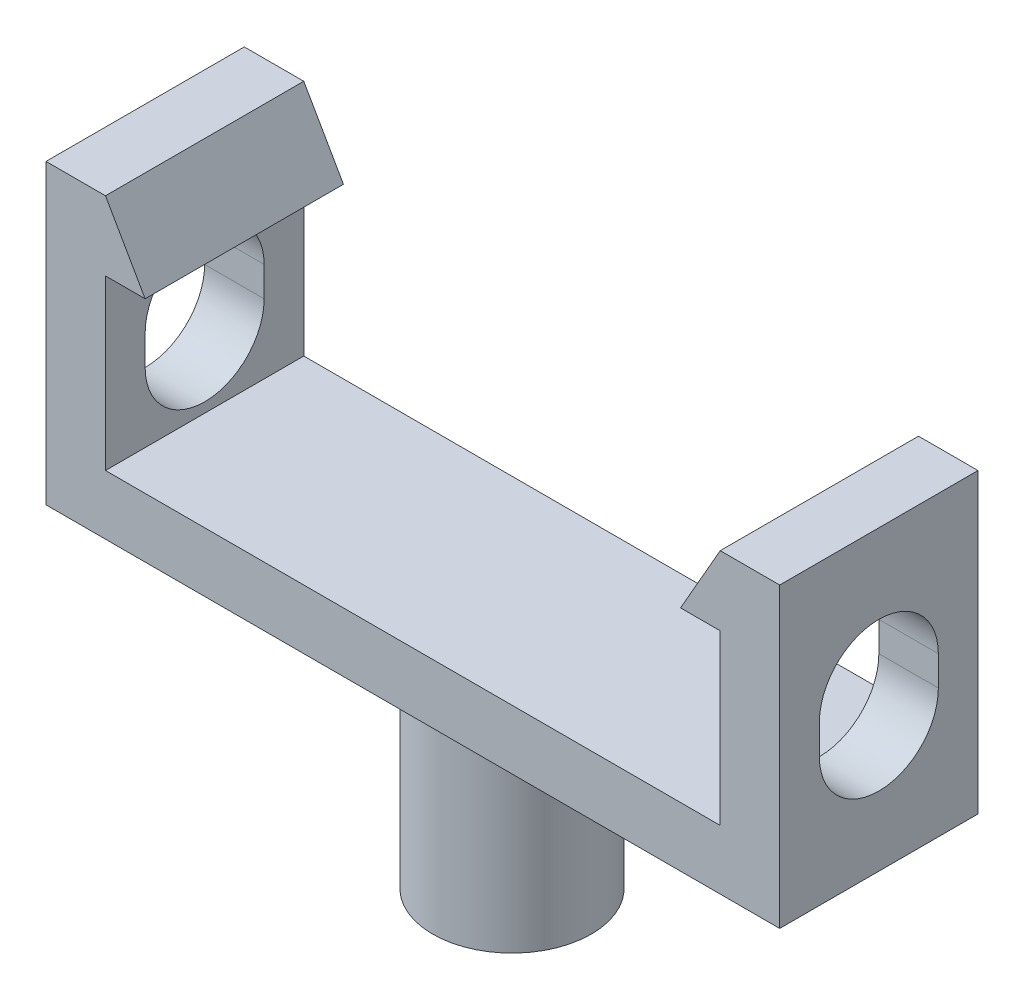
ISO-10303-21;
HEADER;
FILE_DESCRIPTION(('STEP AP214'),'2;1');
FILE_NAME('part.step','',(''),(''),'','','');
FILE_SCHEMA(('AUTOMOTIVE_DESIGN { 1 0 10303 214 1 1 1 1 }'));
ENDSEC;
DATA;
#1=APPLICATION_CONTEXT('core data for automotive mechanical design processes');
#2=APPLICATION_PROTOCOL_DEFINITION('international standard','automotive_design',2000,#1);
#3=PRODUCT_CONTEXT('',#1,'mechanical');
#4=PRODUCT('Part','Part','',(#3));
#5=PRODUCT_RELATED_PRODUCT_CATEGORY('part','',(#4));
#6=PRODUCT_DEFINITION_FORMATION('','',#4);
#7=PRODUCT_DEFINITION_CONTEXT('part definition',#1,'design');
#8=PRODUCT_DEFINITION('design','',#6,#7);
#9=PRODUCT_DEFINITION_SHAPE('','',#8);
#10=(LENGTH_UNIT() NAMED_UNIT(*) SI_UNIT(.MILLI.,.METRE.));
#11=(NAMED_UNIT(*) PLANE_ANGLE_UNIT() SI_UNIT($,.RADIAN.));
#12=(NAMED_UNIT(*) SI_UNIT($,.STERADIAN.) SOLID_ANGLE_UNIT());
#13=UNCERTAINTY_MEASURE_WITH_UNIT(LENGTH_MEASURE(1.E-05),#10,'distance_accuracy_value','');
#14=(GEOMETRIC_REPRESENTATION_CONTEXT(3) GLOBAL_UNCERTAINTY_ASSIGNED_CONTEXT((#13)) GLOBAL_UNIT_ASSIGNED_CONTEXT((#10,
#11,#12)) REPRESENTATION_CONTEXT('',''));
#15=CARTESIAN_POINT('',(0.,0.,0.));
#16=DIRECTION('',(0.,0.,1.));
#17=DIRECTION('',(1.,0.,0.));
#18=AXIS2_PLACEMENT_3D('',#15,#16,#17);
#19=CARTESIAN_POINT('',(0.,12.,10.));
#20=DIRECTION('',(0.86824314212446,0.496138938356833,0.));
#21=DIRECTION('',(-0.496138938356833,0.86824314212446,0.));
#22=AXIS2_PLACEMENT_3D('',#19,#20,#21);
#23=PLANE('',#22);
#24=DIRECTION('',(0.496138938356833,-0.86824314212446,0.));
#25=VECTOR('',#24,1.);
#26=CARTESIAN_POINT('',(0.,12.,0.));
#27=LINE('',#26,#25);
#28=CARTESIAN_POINT('',(0.,12.,0.));
#29=VERTEX_POINT('',#28);
#30=CARTESIAN_POINT('',(2.,8.5,0.));
#31=VERTEX_POINT('',#30);
#32=EDGE_CURVE('E229',#29,#31,#27,.T.);
#33=ORIENTED_EDGE('',*,*,#32,.F.);
#34=DIRECTION('',(0.,0.,-1.));
#35=VECTOR('',#34,1.);
#36=CARTESIAN_POINT('',(0.,12.,10.));
#37=LINE('',#36,#35);
#38=CARTESIAN_POINT('',(0.,12.,10.));
#39=VERTEX_POINT('',#38);
#40=EDGE_CURVE('E288',#39,#29,#37,.T.);
#41=ORIENTED_EDGE('',*,*,#40,.F.);
#42=DIRECTION('',(0.496138938356833,-0.86824314212446,0.));
#43=VECTOR('',#42,1.);
#44=CARTESIAN_POINT('',(0.,12.,10.));
#45=LINE('',#44,#43);
#46=CARTESIAN_POINT('',(2.,8.5,10.));
#47=VERTEX_POINT('',#46);
#48=EDGE_CURVE('E230',#39,#47,#45,.T.);
#49=ORIENTED_EDGE('',*,*,#48,.T.);
#50=DIRECTION('',(0.,0.,-1.));
#51=VECTOR('',#50,1.);
#52=CARTESIAN_POINT('',(2.,8.5,10.));
#53=LINE('',#52,#51);
#54=EDGE_CURVE('E259',#47,#31,#53,.T.);
#55=ORIENTED_EDGE('',*,*,#54,.T.);
#56=EDGE_LOOP('',(#33,#41,#49,#55));
#57=FACE_BOUND('',#56,.T.);
#58=ADVANCED_FACE('F33',(#57),#23,.T.);
#59=CARTESIAN_POINT('',(0.,12.,10.));
#60=DIRECTION('',(0.,-1.,0.));
#61=DIRECTION('',(0.,0.,-1.));
#62=AXIS2_PLACEMENT_3D('',#59,#60,#61);
#63=PLANE('',#62);
#64=DIRECTION('',(-1.,0.,0.));
#65=VECTOR('',#64,1.);
#66=CARTESIAN_POINT('',(0.,12.,0.));
#67=LINE('',#66,#65);
#68=CARTESIAN_POINT('',(-3.,12.,0.));
#69=VERTEX_POINT('',#68);
#70=EDGE_CURVE('E234',#29,#69,#67,.T.);
#71=ORIENTED_EDGE('',*,*,#70,.T.);
#72=DIRECTION('',(0.,0.,-1.));
#73=VECTOR('',#72,1.);
#74=CARTESIAN_POINT('',(-3.,12.,10.));
#75=LINE('',#74,#73);
#76=CARTESIAN_POINT('',(-3.,12.,10.));
#77=VERTEX_POINT('',#76);
#78=EDGE_CURVE('E291',#77,#69,#75,.T.);
#79=ORIENTED_EDGE('',*,*,#78,.F.);
#80=DIRECTION('',(-1.,0.,0.));
#81=VECTOR('',#80,1.);
#82=CARTESIAN_POINT('',(0.,12.,10.));
#83=LINE('',#82,#81);
#84=EDGE_CURVE('E257',#39,#77,#83,.T.);
#85=ORIENTED_EDGE('',*,*,#84,.F.);
#86=ORIENTED_EDGE('',*,*,#40,.T.);
#87=EDGE_LOOP('',(#71,#79,#85,#86));
#88=FACE_BOUND('',#87,.T.);
#89=ADVANCED_FACE('F357',(#88),#63,.F.);
#90=CARTESIAN_POINT('',(-3.,12.,10.));
#91=DIRECTION('',(1.,0.,0.));
#92=DIRECTION('',(0.,1.,0.));
#93=AXIS2_PLACEMENT_3D('',#90,#91,#92);
#94=PLANE('',#93);
#95=DIRECTION('',(0.,-1.,0.));
#96=VECTOR('',#95,1.);
#97=CARTESIAN_POINT('',(-3.,5.,2.));
#98=LINE('',#97,#96);
#99=CARTESIAN_POINT('',(-3.,5.,2.));
#100=VERTEX_POINT('',#99);
#101=CARTESIAN_POINT('',(-3.,3.5,2.));
#102=VERTEX_POINT('',#101);
#103=EDGE_CURVE('E206',#100,#102,#98,.T.);
#104=ORIENTED_EDGE('',*,*,#103,.F.);
#105=CARTESIAN_POINT('',(-3.,5.,5.));
#106=DIRECTION('',(-1.,0.,0.));
#107=DIRECTION('',(0.,-1.,0.));
#108=AXIS2_PLACEMENT_3D('',#105,#106,#107);
#109=CIRCLE('',#108,3.);
#110=CARTESIAN_POINT('',(-3.,5.,8.));
#111=VERTEX_POINT('',#110);
#112=EDGE_CURVE('E48',#111,#100,#109,.T.);
#113=ORIENTED_EDGE('',*,*,#112,.F.);
#114=DIRECTION('',(0.,1.,0.));
#115=VECTOR('',#114,1.);
#116=CARTESIAN_POINT('',(-3.,5.,8.));
#117=LINE('',#116,#115);
#118=CARTESIAN_POINT('',(-3.,3.5,8.));
#119=VERTEX_POINT('',#118);
#120=EDGE_CURVE('E196',#119,#111,#117,.T.);
#121=ORIENTED_EDGE('',*,*,#120,.F.);
#122=CARTESIAN_POINT('',(-3.,3.5,5.));
#123=DIRECTION('',(-1.,0.,0.));
#124=DIRECTION('',(0.,-1.,0.));
#125=AXIS2_PLACEMENT_3D('',#122,#123,#124);
#126=CIRCLE('',#125,3.);
#127=EDGE_CURVE('E199',#102,#119,#126,.T.);
#128=ORIENTED_EDGE('',*,*,#127,.F.);
#129=EDGE_LOOP('',(#104,#113,#121,#128));
#130=FACE_BOUND('',#129,.T.);
#131=DIRECTION('',(0.,-1.,0.));
#132=VECTOR('',#131,1.);
#133=CARTESIAN_POINT('',(-3.,12.,0.));
#134=LINE('',#133,#132);
#135=CARTESIAN_POINT('',(-3.,-3.,0.));
#136=VERTEX_POINT('',#135);
#137=EDGE_CURVE('E285',#69,#136,#134,.T.);
#138=ORIENTED_EDGE('',*,*,#137,.T.);
#139=DIRECTION('',(0.,0.,-1.));
#140=VECTOR('',#139,1.);
#141=CARTESIAN_POINT('',(-3.,-3.,10.));
#142=LINE('',#141,#140);
#143=CARTESIAN_POINT('',(-3.,-3.,10.));
#144=VERTEX_POINT('',#143);
#145=EDGE_CURVE('E294',#144,#136,#142,.T.);
#146=ORIENTED_EDGE('',*,*,#145,.F.);
#147=DIRECTION('',(0.,-1.,0.));
#148=VECTOR('',#147,1.);
#149=CARTESIAN_POINT('',(-3.,12.,10.));
#150=LINE('',#149,#148);
#151=EDGE_CURVE('E255',#77,#144,#150,.T.);
#152=ORIENTED_EDGE('',*,*,#151,.F.);
#153=ORIENTED_EDGE('',*,*,#78,.T.);
#154=EDGE_LOOP('',(#138,#146,#152,#153));
#155=FACE_BOUND('',#154,.T.);
#156=ADVANCED_FACE('F337',(#130,#155),#94,.F.);
#157=CARTESIAN_POINT('',(-3.,-3.,10.));
#158=DIRECTION('',(0.,1.,0.));
#159=DIRECTION('',(-1.,0.,0.));
#160=AXIS2_PLACEMENT_3D('',#157,#158,#159);
#161=PLANE('',#160);
#162=CARTESIAN_POINT('',(15.5,-3.,5.));
#163=DIRECTION('',(0.,-1.,0.));
#164=DIRECTION('',(1.,0.,0.));
#165=AXIS2_PLACEMENT_3D('',#162,#163,#164);
#166=CIRCLE('',#165,3.99999999999999);
#167=CARTESIAN_POINT('',(19.5,-3.,5.));
#168=VERTEX_POINT('',#167);
#169=EDGE_CURVE('E11',#168,#168,#166,.T.);
#170=ORIENTED_EDGE('',*,*,#169,.F.);
#171=EDGE_LOOP('',(#170));
#172=FACE_BOUND('',#171,.T.);
#173=DIRECTION('',(1.,0.,0.));
#174=VECTOR('',#173,1.);
#175=CARTESIAN_POINT('',(-3.,-3.,0.));
#176=LINE('',#175,#174);
#177=CARTESIAN_POINT('',(34.,-3.,0.));
#178=VERTEX_POINT('',#177);
#179=EDGE_CURVE('E283',#136,#178,#176,.T.);
#180=ORIENTED_EDGE('',*,*,#179,.T.);
#181=DIRECTION('',(0.,0.,-1.));
#182=VECTOR('',#181,1.);
#183=CARTESIAN_POINT('',(34.,-3.,10.));
#184=LINE('',#183,#182);
#185=CARTESIAN_POINT('',(34.,-3.,10.));
#186=VERTEX_POINT('',#185);
#187=EDGE_CURVE('E297',#186,#178,#184,.T.);
#188=ORIENTED_EDGE('',*,*,#187,.F.);
#189=DIRECTION('',(1.,0.,0.));
#190=VECTOR('',#189,1.);
#191=CARTESIAN_POINT('',(-3.,-3.,10.));
#192=LINE('',#191,#190);
#193=EDGE_CURVE('E253',#144,#186,#192,.T.);
#194=ORIENTED_EDGE('',*,*,#193,.F.);
#195=ORIENTED_EDGE('',*,*,#145,.T.);
#196=EDGE_LOOP('',(#180,#188,#194,#195));
#197=FACE_BOUND('',#196,.T.);
#198=ADVANCED_FACE('F412',(#172,#197),#161,.F.);
#199=CARTESIAN_POINT('',(34.,-3.,10.));
#200=DIRECTION('',(-1.,0.,0.));
#201=DIRECTION('',(0.,0.,1.));
#202=AXIS2_PLACEMENT_3D('',#199,#200,#201);
#203=PLANE('',#202);
#204=DIRECTION('',(0.,1.,0.));
#205=VECTOR('',#204,1.);
#206=CARTESIAN_POINT('',(34.,5.,8.));
#207=LINE('',#206,#205);
#208=CARTESIAN_POINT('',(34.,3.5,8.));
#209=VERTEX_POINT('',#208);
#210=CARTESIAN_POINT('',(34.,5.,8.));
#211=VERTEX_POINT('',#210);
#212=EDGE_CURVE('E195',#209,#211,#207,.T.);
#213=ORIENTED_EDGE('',*,*,#212,.T.);
#214=CARTESIAN_POINT('',(34.,5.,5.));
#215=DIRECTION('',(-1.,0.,0.));
#216=DIRECTION('',(0.,-1.,0.));
#217=AXIS2_PLACEMENT_3D('',#214,#215,#216);
#218=CIRCLE('',#217,3.);
#219=CARTESIAN_POINT('',(34.,5.,2.));
#220=VERTEX_POINT('',#219);
#221=EDGE_CURVE('E177',#211,#220,#218,.T.);
#222=ORIENTED_EDGE('',*,*,#221,.T.);
#223=DIRECTION('',(0.,-1.,0.));
#224=VECTOR('',#223,1.);
#225=CARTESIAN_POINT('',(34.,5.,2.));
#226=LINE('',#225,#224);
#227=CARTESIAN_POINT('',(34.,3.5,2.));
#228=VERTEX_POINT('',#227);
#229=EDGE_CURVE('E187',#220,#228,#226,.T.);
#230=ORIENTED_EDGE('',*,*,#229,.T.);
#231=CARTESIAN_POINT('',(34.,3.5,5.));
#232=DIRECTION('',(-1.,0.,0.));
#233=DIRECTION('',(0.,-1.,0.));
#234=AXIS2_PLACEMENT_3D('',#231,#232,#233);
#235=CIRCLE('',#234,3.);
#236=EDGE_CURVE('E56',#228,#209,#235,.T.);
#237=ORIENTED_EDGE('',*,*,#236,.T.);
#238=EDGE_LOOP('',(#213,#222,#230,#237));
#239=FACE_BOUND('',#238,.T.);
#240=DIRECTION('',(0.,1.,0.));
#241=VECTOR('',#240,1.);
#242=CARTESIAN_POINT('',(34.,-3.,0.));
#243=LINE('',#242,#241);
#244=CARTESIAN_POINT('',(34.,12.,0.));
#245=VERTEX_POINT('',#244);
#246=EDGE_CURVE('E281',#178,#245,#243,.T.);
#247=ORIENTED_EDGE('',*,*,#246,.T.);
#248=DIRECTION('',(0.,0.,-1.));
#249=VECTOR('',#248,1.);
#250=CARTESIAN_POINT('',(34.,12.,10.));
#251=LINE('',#250,#249);
#252=CARTESIAN_POINT('',(34.,12.,10.));
#253=VERTEX_POINT('',#252);
#254=EDGE_CURVE('E300',#253,#245,#251,.T.);
#255=ORIENTED_EDGE('',*,*,#254,.F.);
#256=DIRECTION('',(0.,1.,0.));
#257=VECTOR('',#256,1.);
#258=CARTESIAN_POINT('',(34.,-3.,10.));
#259=LINE('',#258,#257);
#260=EDGE_CURVE('E251',#186,#253,#259,.T.);
#261=ORIENTED_EDGE('',*,*,#260,.F.);
#262=ORIENTED_EDGE('',*,*,#187,.T.);
#263=EDGE_LOOP('',(#247,#255,#261,#262));
#264=FACE_BOUND('',#263,.T.);
#265=ADVANCED_FACE('F192',(#239,#264),#203,.F.);
#266=CARTESIAN_POINT('',(34.,12.,10.));
#267=DIRECTION('',(0.,-1.,0.));
#268=DIRECTION('',(1.,0.,0.));
#269=AXIS2_PLACEMENT_3D('',#266,#267,#268);
#270=PLANE('',#269);
#271=DIRECTION('',(-1.,0.,0.));
#272=VECTOR('',#271,1.);
#273=CARTESIAN_POINT('',(34.,12.,0.));
#274=LINE('',#273,#272);
#275=CARTESIAN_POINT('',(31.,12.,0.));
#276=VERTEX_POINT('',#275);
#277=EDGE_CURVE('E278',#245,#276,#274,.T.);
#278=ORIENTED_EDGE('',*,*,#277,.T.);
#279=DIRECTION('',(0.,0.,-1.));
#280=VECTOR('',#279,1.);
#281=CARTESIAN_POINT('',(31.,12.,10.));
#282=LINE('',#281,#280);
#283=CARTESIAN_POINT('',(31.,12.,10.));
#284=VERTEX_POINT('',#283);
#285=EDGE_CURVE('E303',#284,#276,#282,.T.);
#286=ORIENTED_EDGE('',*,*,#285,.F.);
#287=DIRECTION('',(-1.,0.,0.));
#288=VECTOR('',#287,1.);
#289=CARTESIAN_POINT('',(34.,12.,10.));
#290=LINE('',#289,#288);
#291=EDGE_CURVE('E249',#253,#284,#290,.T.);
#292=ORIENTED_EDGE('',*,*,#291,.F.);
#293=ORIENTED_EDGE('',*,*,#254,.T.);
#294=EDGE_LOOP('',(#278,#286,#292,#293));
#295=FACE_BOUND('',#294,.T.);
#296=ADVANCED_FACE('F408',(#295),#270,.F.);
#297=CARTESIAN_POINT('',(29.,8.5,10.));
#298=DIRECTION('',(-0.868243142124459,0.496138938356834,0.));
#299=DIRECTION('',(-0.496138938356834,-0.868243142124459,0.));
#300=AXIS2_PLACEMENT_3D('',#297,#298,#299);
#301=PLANE('',#300);
#302=DIRECTION('',(0.496138938356834,0.868243142124459,0.));
#303=VECTOR('',#302,1.);
#304=CARTESIAN_POINT('',(29.,8.5,0.));
#305=LINE('',#304,#303);
#306=CARTESIAN_POINT('',(29.,8.5,0.));
#307=VERTEX_POINT('',#306);
#308=EDGE_CURVE('E275',#307,#276,#305,.T.);
#309=ORIENTED_EDGE('',*,*,#308,.F.);
#310=DIRECTION('',(0.,0.,-1.));
#311=VECTOR('',#310,1.);
#312=CARTESIAN_POINT('',(29.,8.5,10.));
#313=LINE('',#312,#311);
#314=CARTESIAN_POINT('',(29.,8.5,10.));
#315=VERTEX_POINT('',#314);
#316=EDGE_CURVE('E305',#315,#307,#313,.T.);
#317=ORIENTED_EDGE('',*,*,#316,.F.);
#318=DIRECTION('',(0.496138938356834,0.868243142124459,0.));
#319=VECTOR('',#318,1.);
#320=CARTESIAN_POINT('',(29.,8.5,10.));
#321=LINE('',#320,#319);
#322=EDGE_CURVE('E246',#315,#284,#321,.T.);
#323=ORIENTED_EDGE('',*,*,#322,.T.);
#324=ORIENTED_EDGE('',*,*,#285,.T.);
#325=EDGE_LOOP('',(#309,#317,#323,#324));
#326=FACE_BOUND('',#325,.T.);
#327=ADVANCED_FACE('F403',(#326),#301,.T.);
#328=CARTESIAN_POINT('',(31.,8.5,10.));
#329=DIRECTION('',(0.,-1.,0.));
#330=DIRECTION('',(1.,0.,0.));
#331=AXIS2_PLACEMENT_3D('',#328,#329,#330);
#332=PLANE('',#331);
#333=DIRECTION('',(-1.,0.,0.));
#334=VECTOR('',#333,1.);
#335=CARTESIAN_POINT('',(31.,8.5,0.));
#336=LINE('',#335,#334);
#337=CARTESIAN_POINT('',(31.,8.5,0.));
#338=VERTEX_POINT('',#337);
#339=EDGE_CURVE('E272',#338,#307,#336,.T.);
#340=ORIENTED_EDGE('',*,*,#339,.F.);
#341=DIRECTION('',(0.,0.,-1.));
#342=VECTOR('',#341,1.);
#343=CARTESIAN_POINT('',(31.,8.5,10.));
#344=LINE('',#343,#342);
#345=CARTESIAN_POINT('',(31.,8.5,10.));
#346=VERTEX_POINT('',#345);
#347=EDGE_CURVE('E307',#346,#338,#344,.T.);
#348=ORIENTED_EDGE('',*,*,#347,.F.);
#349=DIRECTION('',(-1.,0.,0.));
#350=VECTOR('',#349,1.);
#351=CARTESIAN_POINT('',(31.,8.5,10.));
#352=LINE('',#351,#350);
#353=EDGE_CURVE('E243',#346,#315,#352,.T.);
#354=ORIENTED_EDGE('',*,*,#353,.T.);
#355=ORIENTED_EDGE('',*,*,#316,.T.);
#356=EDGE_LOOP('',(#340,#348,#354,#355));
#357=FACE_BOUND('',#356,.T.);
#358=ADVANCED_FACE('F398',(#357),#332,.T.);
#359=CARTESIAN_POINT('',(31.,8.5,10.));
#360=DIRECTION('',(1.,0.,0.));
#361=DIRECTION('',(0.,0.,-1.));
#362=AXIS2_PLACEMENT_3D('',#359,#360,#361);
#363=PLANE('',#362);
#364=DIRECTION('',(0.,1.,0.));
#365=VECTOR('',#364,1.);
#366=CARTESIAN_POINT('',(31.,8.5,2.));
#367=LINE('',#366,#365);
#368=CARTESIAN_POINT('',(31.,3.5,2.));
#369=VERTEX_POINT('',#368);
#370=CARTESIAN_POINT('',(31.,5.,2.));
#371=VERTEX_POINT('',#370);
#372=EDGE_CURVE('E214',#369,#371,#367,.T.);
#373=ORIENTED_EDGE('',*,*,#372,.T.);
#374=CARTESIAN_POINT('',(31.,5.,5.));
#375=DIRECTION('',(1.,0.,0.));
#376=DIRECTION('',(0.,0.,-1.));
#377=AXIS2_PLACEMENT_3D('',#374,#375,#376);
#378=CIRCLE('',#377,3.);
#379=CARTESIAN_POINT('',(31.,5.,8.));
#380=VERTEX_POINT('',#379);
#381=EDGE_CURVE('E180',#371,#380,#378,.T.);
#382=ORIENTED_EDGE('',*,*,#381,.T.);
#383=DIRECTION('',(0.,-1.,0.));
#384=VECTOR('',#383,1.);
#385=CARTESIAN_POINT('',(31.,8.5,8.));
#386=LINE('',#385,#384);
#387=CARTESIAN_POINT('',(31.,3.5,8.));
#388=VERTEX_POINT('',#387);
#389=EDGE_CURVE('E225',#380,#388,#386,.T.);
#390=ORIENTED_EDGE('',*,*,#389,.T.);
#391=CARTESIAN_POINT('',(31.,3.5,5.));
#392=DIRECTION('',(1.,0.,0.));
#393=DIRECTION('',(0.,0.,-1.));
#394=AXIS2_PLACEMENT_3D('',#391,#392,#393);
#395=CIRCLE('',#394,3.);
#396=EDGE_CURVE('E222',#388,#369,#395,.T.);
#397=ORIENTED_EDGE('',*,*,#396,.T.);
#398=EDGE_LOOP('',(#373,#382,#390,#397));
#399=FACE_BOUND('',#398,.T.);
#400=DIRECTION('',(0.,-1.,0.));
#401=VECTOR('',#400,1.);
#402=CARTESIAN_POINT('',(31.,8.5,0.));
#403=LINE('',#402,#401);
#404=CARTESIAN_POINT('',(31.,0.,0.));
#405=VERTEX_POINT('',#404);
#406=EDGE_CURVE('E270',#338,#405,#403,.T.);
#407=ORIENTED_EDGE('',*,*,#406,.T.);
#408=DIRECTION('',(0.,0.,-1.));
#409=VECTOR('',#408,1.);
#410=CARTESIAN_POINT('',(31.,0.,10.));
#411=LINE('',#410,#409);
#412=CARTESIAN_POINT('',(31.,0.,10.));
#413=VERTEX_POINT('',#412);
#414=EDGE_CURVE('E309',#413,#405,#411,.T.);
#415=ORIENTED_EDGE('',*,*,#414,.F.);
#416=DIRECTION('',(0.,-1.,0.));
#417=VECTOR('',#416,1.);
#418=CARTESIAN_POINT('',(31.,8.5,10.));
#419=LINE('',#418,#417);
#420=EDGE_CURVE('E241',#346,#413,#419,.T.);
#421=ORIENTED_EDGE('',*,*,#420,.F.);
#422=ORIENTED_EDGE('',*,*,#347,.T.);
#423=EDGE_LOOP('',(#407,#415,#421,#422));
#424=FACE_BOUND('',#423,.T.);
#425=ADVANCED_FACE('F395',(#399,#424),#363,.F.);
#426=CARTESIAN_POINT('',(31.,0.,10.));
#427=DIRECTION('',(0.,-1.,0.));
#428=DIRECTION('',(0.,0.,-1.));
#429=AXIS2_PLACEMENT_3D('',#426,#427,#428);
#430=PLANE('',#429);
#431=DIRECTION('',(-1.,0.,0.));
#432=VECTOR('',#431,1.);
#433=CARTESIAN_POINT('',(31.,0.,0.));
#434=LINE('',#433,#432);
#435=CARTESIAN_POINT('',(0.,0.,0.));
#436=VERTEX_POINT('',#435);
#437=EDGE_CURVE('E268',#405,#436,#434,.T.);
#438=ORIENTED_EDGE('',*,*,#437,.T.);
#439=DIRECTION('',(0.,0.,-1.));
#440=VECTOR('',#439,1.);
#441=CARTESIAN_POINT('',(0.,0.,10.));
#442=LINE('',#441,#440);
#443=CARTESIAN_POINT('',(0.,0.,10.));
#444=VERTEX_POINT('',#443);
#445=EDGE_CURVE('E312',#444,#436,#442,.T.);
#446=ORIENTED_EDGE('',*,*,#445,.F.);
#447=DIRECTION('',(-1.,0.,0.));
#448=VECTOR('',#447,1.);
#449=CARTESIAN_POINT('',(31.,0.,10.));
#450=LINE('',#449,#448);
#451=EDGE_CURVE('E239',#413,#444,#450,.T.);
#452=ORIENTED_EDGE('',*,*,#451,.F.);
#453=ORIENTED_EDGE('',*,*,#414,.T.);
#454=EDGE_LOOP('',(#438,#446,#452,#453));
#455=FACE_BOUND('',#454,.T.);
#456=ADVANCED_FACE('F390',(#455),#430,.F.);
#457=CARTESIAN_POINT('',(0.,0.,10.));
#458=DIRECTION('',(-1.,0.,0.));
#459=DIRECTION('',(0.,0.,1.));
#460=AXIS2_PLACEMENT_3D('',#457,#458,#459);
#461=PLANE('',#460);
#462=DIRECTION('',(0.,1.,0.));
#463=VECTOR('',#462,1.);
#464=CARTESIAN_POINT('',(0.,0.,8.));
#465=LINE('',#464,#463);
#466=CARTESIAN_POINT('',(0.,3.5,8.));
#467=VERTEX_POINT('',#466);
#468=CARTESIAN_POINT('',(0.,5.,8.));
#469=VERTEX_POINT('',#468);
#470=EDGE_CURVE('E322',#467,#469,#465,.T.);
#471=ORIENTED_EDGE('',*,*,#470,.T.);
#472=CARTESIAN_POINT('',(0.,5.,5.));
#473=DIRECTION('',(-1.,0.,0.));
#474=DIRECTION('',(0.,0.,1.));
#475=AXIS2_PLACEMENT_3D('',#472,#473,#474);
#476=CIRCLE('',#475,3.);
#477=CARTESIAN_POINT('',(0.,5.,2.));
#478=VERTEX_POINT('',#477);
#479=EDGE_CURVE('E36',#469,#478,#476,.T.);
#480=ORIENTED_EDGE('',*,*,#479,.T.);
#481=DIRECTION('',(0.,-1.,0.));
#482=VECTOR('',#481,1.);
#483=CARTESIAN_POINT('',(0.,0.,2.));
#484=LINE('',#483,#482);
#485=CARTESIAN_POINT('',(0.,3.5,2.));
#486=VERTEX_POINT('',#485);
#487=EDGE_CURVE('E290',#478,#486,#484,.T.);
#488=ORIENTED_EDGE('',*,*,#487,.T.);
#489=CARTESIAN_POINT('',(0.,3.5,5.));
#490=DIRECTION('',(-1.,0.,0.));
#491=DIRECTION('',(0.,0.,1.));
#492=AXIS2_PLACEMENT_3D('',#489,#490,#491);
#493=CIRCLE('',#492,3.);
#494=EDGE_CURVE('E320',#486,#467,#493,.T.);
#495=ORIENTED_EDGE('',*,*,#494,.T.);
#496=EDGE_LOOP('',(#471,#480,#488,#495));
#497=FACE_BOUND('',#496,.T.);
#498=DIRECTION('',(0.,1.,0.));
#499=VECTOR('',#498,1.);
#500=CARTESIAN_POINT('',(0.,0.,0.));
#501=LINE('',#500,#499);
#502=CARTESIAN_POINT('',(0.,8.5,0.));
#503=VERTEX_POINT('',#502);
#504=EDGE_CURVE('E265',#436,#503,#501,.T.);
#505=ORIENTED_EDGE('',*,*,#504,.T.);
#506=DIRECTION('',(0.,0.,-1.));
#507=VECTOR('',#506,1.);
#508=CARTESIAN_POINT('',(0.,8.5,10.));
#509=LINE('',#508,#507);
#510=CARTESIAN_POINT('',(0.,8.5,10.));
#511=VERTEX_POINT('',#510);
#512=EDGE_CURVE('E315',#511,#503,#509,.T.);
#513=ORIENTED_EDGE('',*,*,#512,.F.);
#514=DIRECTION('',(0.,1.,0.));
#515=VECTOR('',#514,1.);
#516=CARTESIAN_POINT('',(0.,0.,10.));
#517=LINE('',#516,#515);
#518=EDGE_CURVE('E237',#444,#511,#517,.T.);
#519=ORIENTED_EDGE('',*,*,#518,.F.);
#520=ORIENTED_EDGE('',*,*,#445,.T.);
#521=EDGE_LOOP('',(#505,#513,#519,#520));
#522=FACE_BOUND('',#521,.T.);
#523=ADVANCED_FACE('F326',(#497,#522),#461,.F.);
#524=CARTESIAN_POINT('',(2.,8.5,10.));
#525=DIRECTION('',(0.,-1.,0.));
#526=DIRECTION('',(0.,0.,-1.));
#527=AXIS2_PLACEMENT_3D('',#524,#525,#526);
#528=PLANE('',#527);
#529=DIRECTION('',(-1.,0.,0.));
#530=VECTOR('',#529,1.);
#531=CARTESIAN_POINT('',(2.,8.5,0.));
#532=LINE('',#531,#530);
#533=EDGE_CURVE('E262',#31,#503,#532,.T.);
#534=ORIENTED_EDGE('',*,*,#533,.F.);
#535=ORIENTED_EDGE('',*,*,#54,.F.);
#536=DIRECTION('',(-1.,0.,0.));
#537=VECTOR('',#536,1.);
#538=CARTESIAN_POINT('',(2.,8.5,10.));
#539=LINE('',#538,#537);
#540=EDGE_CURVE('E233',#47,#511,#539,.T.);
#541=ORIENTED_EDGE('',*,*,#540,.T.);
#542=ORIENTED_EDGE('',*,*,#512,.T.);
#543=EDGE_LOOP('',(#534,#535,#541,#542));
#544=FACE_BOUND('',#543,.T.);
#545=ADVANCED_FACE('F384',(#544),#528,.T.);
#546=CARTESIAN_POINT('',(0.,0.,10.));
#547=DIRECTION('',(0.,0.,-1.));
#548=DIRECTION('',(-1.,0.,0.));
#549=AXIS2_PLACEMENT_3D('',#546,#547,#548);
#550=PLANE('',#549);
#551=ORIENTED_EDGE('',*,*,#48,.F.);
#552=ORIENTED_EDGE('',*,*,#84,.T.);
#553=ORIENTED_EDGE('',*,*,#151,.T.);
#554=ORIENTED_EDGE('',*,*,#193,.T.);
#555=ORIENTED_EDGE('',*,*,#260,.T.);
#556=ORIENTED_EDGE('',*,*,#291,.T.);
#557=ORIENTED_EDGE('',*,*,#322,.F.);
#558=ORIENTED_EDGE('',*,*,#353,.F.);
#559=ORIENTED_EDGE('',*,*,#420,.T.);
#560=ORIENTED_EDGE('',*,*,#451,.T.);
#561=ORIENTED_EDGE('',*,*,#518,.T.);
#562=ORIENTED_EDGE('',*,*,#540,.F.);
#563=EDGE_LOOP('',(#551,#552,#553,#554,#555,#556,#557,#558,#559,#560,#561,#562));
#564=FACE_BOUND('',#563,.T.);
#565=ADVANCED_FACE('F378',(#564),#550,.F.);
#566=CARTESIAN_POINT('',(0.,0.,0.));
#567=DIRECTION('',(0.,0.,-1.));
#568=DIRECTION('',(-1.,0.,0.));
#569=AXIS2_PLACEMENT_3D('',#566,#567,#568);
#570=PLANE('',#569);
#571=ORIENTED_EDGE('',*,*,#32,.T.);
#572=ORIENTED_EDGE('',*,*,#533,.T.);
#573=ORIENTED_EDGE('',*,*,#504,.F.);
#574=ORIENTED_EDGE('',*,*,#437,.F.);
#575=ORIENTED_EDGE('',*,*,#406,.F.);
#576=ORIENTED_EDGE('',*,*,#339,.T.);
#577=ORIENTED_EDGE('',*,*,#308,.T.);
#578=ORIENTED_EDGE('',*,*,#277,.F.);
#579=ORIENTED_EDGE('',*,*,#246,.F.);
#580=ORIENTED_EDGE('',*,*,#179,.F.);
#581=ORIENTED_EDGE('',*,*,#137,.F.);
#582=ORIENTED_EDGE('',*,*,#70,.F.);
#583=EDGE_LOOP('',(#571,#572,#573,#574,#575,#576,#577,#578,#579,#580,#581,#582));
#584=FACE_BOUND('',#583,.T.);
#585=ADVANCED_FACE('F353',(#584),#570,.T.);
#586=CARTESIAN_POINT('',(34.,5.,2.));
#587=DIRECTION('',(0.,0.,-1.));
#588=DIRECTION('',(-1.,0.,0.));
#589=AXIS2_PLACEMENT_3D('',#586,#587,#588);
#590=PLANE('',#589);
#591=DIRECTION('',(-1.,0.,0.));
#592=VECTOR('',#591,1.);
#593=CARTESIAN_POINT('',(34.,5.,2.));
#594=LINE('',#593,#592);
#595=EDGE_CURVE('E184',#478,#100,#594,.T.);
#596=ORIENTED_EDGE('',*,*,#595,.T.);
#597=ORIENTED_EDGE('',*,*,#103,.T.);
#598=DIRECTION('',(-1.,0.,0.));
#599=VECTOR('',#598,1.);
#600=CARTESIAN_POINT('',(34.,3.5,2.));
#601=LINE('',#600,#599);
#602=EDGE_CURVE('E183',#486,#102,#601,.T.);
#603=ORIENTED_EDGE('',*,*,#602,.F.);
#604=ORIENTED_EDGE('',*,*,#487,.F.);
#605=EDGE_LOOP('',(#596,#597,#603,#604));
#606=FACE_BOUND('',#605,.T.);
#607=ADVANCED_FACE('F340',(#606),#590,.F.);
#608=CARTESIAN_POINT('',(34.,3.5,5.));
#609=DIRECTION('',(-1.,0.,0.));
#610=DIRECTION('',(0.,-1.,0.));
#611=AXIS2_PLACEMENT_3D('',#608,#609,#610);
#612=CYLINDRICAL_SURFACE('',#611,3.);
#613=ORIENTED_EDGE('',*,*,#602,.T.);
#614=ORIENTED_EDGE('',*,*,#127,.T.);
#615=DIRECTION('',(-1.,0.,0.));
#616=VECTOR('',#615,1.);
#617=CARTESIAN_POINT('',(34.,3.5,8.));
#618=LINE('',#617,#616);
#619=EDGE_CURVE('E219',#467,#119,#618,.T.);
#620=ORIENTED_EDGE('',*,*,#619,.F.);
#621=ORIENTED_EDGE('',*,*,#494,.F.);
#622=EDGE_LOOP('',(#613,#614,#620,#621));
#623=FACE_BOUND('',#622,.T.);
#624=ADVANCED_FACE('F343',(#623),#612,.F.);
#625=CARTESIAN_POINT('',(34.,5.,8.));
#626=DIRECTION('',(0.,0.,1.));
#627=DIRECTION('',(1.,0.,0.));
#628=AXIS2_PLACEMENT_3D('',#625,#626,#627);
#629=PLANE('',#628);
#630=ORIENTED_EDGE('',*,*,#619,.T.);
#631=ORIENTED_EDGE('',*,*,#120,.T.);
#632=DIRECTION('',(-1.,0.,0.));
#633=VECTOR('',#632,1.);
#634=CARTESIAN_POINT('',(34.,5.,8.));
#635=LINE('',#634,#633);
#636=EDGE_CURVE('E215',#469,#111,#635,.T.);
#637=ORIENTED_EDGE('',*,*,#636,.F.);
#638=ORIENTED_EDGE('',*,*,#470,.F.);
#639=EDGE_LOOP('',(#630,#631,#637,#638));
#640=FACE_BOUND('',#639,.T.);
#641=ADVANCED_FACE('F331',(#640),#629,.F.);
#642=CARTESIAN_POINT('',(34.,5.,5.));
#643=DIRECTION('',(-1.,0.,0.));
#644=DIRECTION('',(0.,-1.,0.));
#645=AXIS2_PLACEMENT_3D('',#642,#643,#644);
#646=CYLINDRICAL_SURFACE('',#645,3.);
#647=ORIENTED_EDGE('',*,*,#636,.T.);
#648=ORIENTED_EDGE('',*,*,#112,.T.);
#649=ORIENTED_EDGE('',*,*,#595,.F.);
#650=ORIENTED_EDGE('',*,*,#479,.F.);
#651=EDGE_LOOP('',(#647,#648,#649,#650));
#652=FACE_BOUND('',#651,.T.);
#653=ADVANCED_FACE('F329',(#652),#646,.F.);
#654=EDGE_CURVE('E172',#220,#371,#594,.T.);
#655=ORIENTED_EDGE('',*,*,#654,.F.);
#656=ORIENTED_EDGE('',*,*,#221,.F.);
#657=EDGE_CURVE('E212',#211,#380,#635,.T.);
#658=ORIENTED_EDGE('',*,*,#657,.T.);
#659=ORIENTED_EDGE('',*,*,#381,.F.);
#660=EDGE_LOOP('',(#655,#656,#658,#659));
#661=FACE_BOUND('',#660,.T.);
#662=ADVANCED_FACE('F174',(#661),#646,.F.);
#663=ORIENTED_EDGE('',*,*,#657,.F.);
#664=ORIENTED_EDGE('',*,*,#212,.F.);
#665=EDGE_CURVE('E216',#209,#388,#618,.T.);
#666=ORIENTED_EDGE('',*,*,#665,.T.);
#667=ORIENTED_EDGE('',*,*,#389,.F.);
#668=EDGE_LOOP('',(#663,#664,#666,#667));
#669=FACE_BOUND('',#668,.T.);
#670=ADVANCED_FACE('F352',(#669),#629,.F.);
#671=ORIENTED_EDGE('',*,*,#665,.F.);
#672=ORIENTED_EDGE('',*,*,#236,.F.);
#673=EDGE_CURVE('E189',#228,#369,#601,.T.);
#674=ORIENTED_EDGE('',*,*,#673,.T.);
#675=ORIENTED_EDGE('',*,*,#396,.F.);
#676=EDGE_LOOP('',(#671,#672,#674,#675));
#677=FACE_BOUND('',#676,.T.);
#678=ADVANCED_FACE('F346',(#677),#612,.F.);
#679=ORIENTED_EDGE('',*,*,#673,.F.);
#680=ORIENTED_EDGE('',*,*,#229,.F.);
#681=ORIENTED_EDGE('',*,*,#654,.T.);
#682=ORIENTED_EDGE('',*,*,#372,.F.);
#683=EDGE_LOOP('',(#679,#680,#681,#682));
#684=FACE_BOUND('',#683,.T.);
#685=ADVANCED_FACE('F188',(#684),#590,.F.);
#686=CARTESIAN_POINT('',(15.5,-13.,5.));
#687=DIRECTION('',(0.,1.,0.));
#688=DIRECTION('',(-1.,0.,0.));
#689=AXIS2_PLACEMENT_3D('',#686,#687,#688);
#690=CYLINDRICAL_SURFACE('',#689,3.99999999999999);
#691=CARTESIAN_POINT('',(15.5,-13.,5.));
#692=DIRECTION('',(0.,-1.,0.));
#693=DIRECTION('',(1.,0.,0.));
#694=AXIS2_PLACEMENT_3D('',#691,#692,#693);
#695=CIRCLE('',#694,3.99999999999999);
#696=CARTESIAN_POINT('',(19.5,-13.,5.));
#697=VERTEX_POINT('',#696);
#698=EDGE_CURVE('E207',#697,#697,#695,.T.);
#699=ORIENTED_EDGE('',*,*,#698,.F.);
#700=EDGE_LOOP('',(#699));
#701=FACE_BOUND('',#700,.T.);
#702=ORIENTED_EDGE('',*,*,#169,.T.);
#703=EDGE_LOOP('',(#702));
#704=FACE_BOUND('',#703,.T.);
#705=ADVANCED_FACE('F448',(#701,#704),#690,.T.);
#706=CARTESIAN_POINT('',(15.5,-13.,5.));
#707=DIRECTION('',(0.,-1.,0.));
#708=DIRECTION('',(1.,0.,0.));
#709=AXIS2_PLACEMENT_3D('',#706,#707,#708);
#710=PLANE('',#709);
#711=ORIENTED_EDGE('',*,*,#698,.T.);
#712=EDGE_LOOP('',(#711));
#713=FACE_BOUND('',#712,.T.);
#714=ADVANCED_FACE('F452',(#713),#710,.T.);
#715=CLOSED_SHELL('',(#58,#89,#156,#198,#265,#296,#327,#358,#425,#456,#523,#545,#565,#585,#607,
#624,#641,#653,#662,#670,#678,#685,#705,#714));
#716=MANIFOLD_SOLID_BREP('B2',#715);
#717=ADVANCED_BREP_SHAPE_REPRESENTATION('',(#18,#716),#14);
#718=SHAPE_DEFINITION_REPRESENTATION(#9,#717);
ENDSEC;
END-ISO-10303-21;
